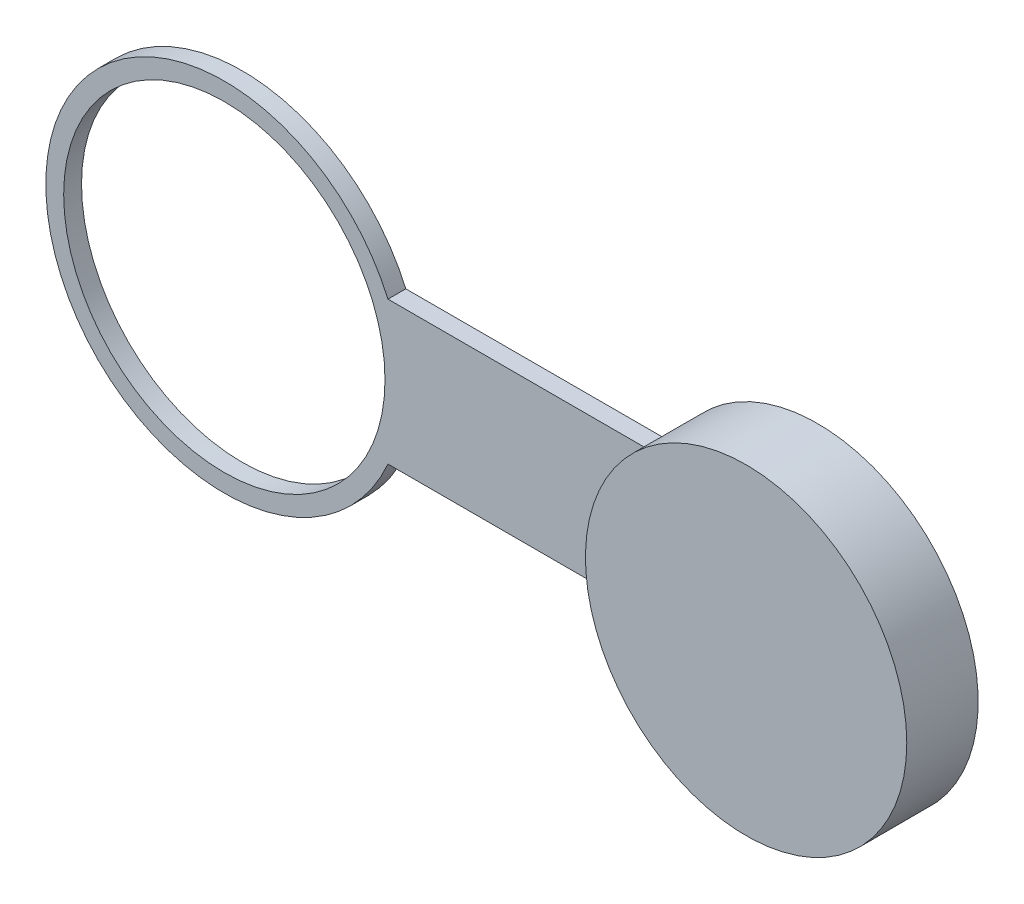
ISO-10303-21;
HEADER;
FILE_DESCRIPTION(('STEP AP214'),'2;1');
FILE_NAME('part.step','',(''),(''),'','','');
FILE_SCHEMA(('AUTOMOTIVE_DESIGN { 1 0 10303 214 1 1 1 1 }'));
ENDSEC;
DATA;
#1=APPLICATION_CONTEXT('core data for automotive mechanical design processes');
#2=APPLICATION_PROTOCOL_DEFINITION('international standard','automotive_design',2000,#1);
#3=PRODUCT_CONTEXT('',#1,'mechanical');
#4=PRODUCT('Part','Part','',(#3));
#5=PRODUCT_RELATED_PRODUCT_CATEGORY('part','',(#4));
#6=PRODUCT_DEFINITION_FORMATION('','',#4);
#7=PRODUCT_DEFINITION_CONTEXT('part definition',#1,'design');
#8=PRODUCT_DEFINITION('design','',#6,#7);
#9=PRODUCT_DEFINITION_SHAPE('','',#8);
#10=(LENGTH_UNIT() NAMED_UNIT(*) SI_UNIT(.MILLI.,.METRE.));
#11=(NAMED_UNIT(*) PLANE_ANGLE_UNIT() SI_UNIT($,.RADIAN.));
#12=(NAMED_UNIT(*) SI_UNIT($,.STERADIAN.) SOLID_ANGLE_UNIT());
#13=UNCERTAINTY_MEASURE_WITH_UNIT(LENGTH_MEASURE(1.E-05),#10,'distance_accuracy_value','');
#14=(GEOMETRIC_REPRESENTATION_CONTEXT(3) GLOBAL_UNCERTAINTY_ASSIGNED_CONTEXT((#13)) GLOBAL_UNIT_ASSIGNED_CONTEXT((#10,
#11,#12)) REPRESENTATION_CONTEXT('',''));
#15=CARTESIAN_POINT('',(0.,0.,0.));
#16=DIRECTION('',(0.,0.,1.));
#17=DIRECTION('',(1.,0.,0.));
#18=AXIS2_PLACEMENT_3D('',#15,#16,#17);
#19=CARTESIAN_POINT('',(0.,0.,20.));
#20=DIRECTION('',(0.,0.,-1.));
#21=DIRECTION('',(-1.,0.,0.));
#22=AXIS2_PLACEMENT_3D('',#19,#20,#21);
#23=CYLINDRICAL_SURFACE('',#22,45.);
#24=CARTESIAN_POINT('',(0.,0.,4.99999999999999));
#25=DIRECTION('',(0.,0.,-1.));
#26=DIRECTION('',(-1.,0.,0.));
#27=AXIS2_PLACEMENT_3D('',#24,#25,#26);
#28=CIRCLE('',#27,45.);
#29=CARTESIAN_POINT('',(-40.3112887414928,-20.,4.99999999999999));
#30=VERTEX_POINT('',#29);
#31=CARTESIAN_POINT('',(-40.3112887414928,20.,4.99999999999999));
#32=VERTEX_POINT('',#31);
#33=EDGE_CURVE('E51',#30,#32,#28,.T.);
#34=ORIENTED_EDGE('',*,*,#33,.F.);
#35=DIRECTION('',(0.,0.,-1.));
#36=VECTOR('',#35,1.);
#37=CARTESIAN_POINT('',(-40.3112887414928,-20.,4.99999999999999));
#38=LINE('',#37,#36);
#39=CARTESIAN_POINT('',(-40.3112887414928,-20.,0.));
#40=VERTEX_POINT('',#39);
#41=EDGE_CURVE('E95',#30,#40,#38,.T.);
#42=ORIENTED_EDGE('',*,*,#41,.T.);
#43=CARTESIAN_POINT('',(0.,0.,0.));
#44=DIRECTION('',(0.,0.,1.));
#45=DIRECTION('',(1.,0.,0.));
#46=AXIS2_PLACEMENT_3D('',#43,#44,#45);
#47=CIRCLE('',#46,45.);
#48=CARTESIAN_POINT('',(-40.3112887414928,20.,0.));
#49=VERTEX_POINT('',#48);
#50=EDGE_CURVE('E36',#40,#49,#47,.T.);
#51=ORIENTED_EDGE('',*,*,#50,.T.);
#52=DIRECTION('',(0.,0.,-1.));
#53=VECTOR('',#52,1.);
#54=CARTESIAN_POINT('',(-40.3112887414928,20.,4.99999999999999));
#55=LINE('',#54,#53);
#56=EDGE_CURVE('E47',#32,#49,#55,.T.);
#57=ORIENTED_EDGE('',*,*,#56,.F.);
#58=EDGE_LOOP('',(#34,#42,#51,#57));
#59=FACE_BOUND('',#58,.T.);
#60=CARTESIAN_POINT('',(0.,0.,20.));
#61=DIRECTION('',(0.,0.,1.));
#62=DIRECTION('',(1.,0.,0.));
#63=AXIS2_PLACEMENT_3D('',#60,#61,#62);
#64=CIRCLE('',#63,45.);
#65=CARTESIAN_POINT('',(45.,0.,20.));
#66=VERTEX_POINT('',#65);
#67=EDGE_CURVE('E11',#66,#66,#64,.T.);
#68=ORIENTED_EDGE('',*,*,#67,.F.);
#69=EDGE_LOOP('',(#68));
#70=FACE_BOUND('',#69,.T.);
#71=ADVANCED_FACE('F33',(#59,#70),#23,.T.);
#72=CARTESIAN_POINT('',(0.,0.,20.));
#73=DIRECTION('',(0.,0.,1.));
#74=DIRECTION('',(1.,0.,0.));
#75=AXIS2_PLACEMENT_3D('',#72,#73,#74);
#76=PLANE('',#75);
#77=ORIENTED_EDGE('',*,*,#67,.T.);
#78=EDGE_LOOP('',(#77));
#79=FACE_BOUND('',#78,.T.);
#80=ADVANCED_FACE('F121',(#79),#76,.T.);
#81=CARTESIAN_POINT('',(0.,0.,0.));
#82=DIRECTION('',(0.,0.,1.));
#83=DIRECTION('',(1.,0.,0.));
#84=AXIS2_PLACEMENT_3D('',#81,#82,#83);
#85=PLANE('',#84);
#86=ORIENTED_EDGE('',*,*,#50,.F.);
#87=DIRECTION('',(-1.,0.,0.));
#88=VECTOR('',#87,1.);
#89=CARTESIAN_POINT('',(0.,-20.,0.));
#90=LINE('',#89,#88);
#91=CARTESIAN_POINT('',(-115.311288741493,-20.,0.));
#92=VERTEX_POINT('',#91);
#93=EDGE_CURVE('E106',#40,#92,#90,.T.);
#94=ORIENTED_EDGE('',*,*,#93,.T.);
#95=CARTESIAN_POINT('',(-161.137045691051,0.,0.));
#96=DIRECTION('',(0.,0.,-1.));
#97=DIRECTION('',(-1.,0.,0.));
#98=AXIS2_PLACEMENT_3D('',#95,#96,#97);
#99=CIRCLE('',#98,50.);
#100=CARTESIAN_POINT('',(-115.311288741493,20.,0.));
#101=VERTEX_POINT('',#100);
#102=EDGE_CURVE('E77',#92,#101,#99,.T.);
#103=ORIENTED_EDGE('',*,*,#102,.T.);
#104=DIRECTION('',(-1.,0.,0.));
#105=VECTOR('',#104,1.);
#106=CARTESIAN_POINT('',(0.,20.,0.));
#107=LINE('',#106,#105);
#108=EDGE_CURVE('E99',#49,#101,#107,.T.);
#109=ORIENTED_EDGE('',*,*,#108,.F.);
#110=EDGE_LOOP('',(#86,#94,#103,#109));
#111=FACE_BOUND('',#110,.T.);
#112=CARTESIAN_POINT('',(-161.137045691051,0.,0.));
#113=DIRECTION('',(0.,0.,-1.));
#114=DIRECTION('',(-1.,0.,0.));
#115=AXIS2_PLACEMENT_3D('',#112,#113,#114);
#116=CIRCLE('',#115,45.);
#117=CARTESIAN_POINT('',(-206.137045691051,0.,0.));
#118=VERTEX_POINT('',#117);
#119=EDGE_CURVE('E96',#118,#118,#116,.T.);
#120=ORIENTED_EDGE('',*,*,#119,.F.);
#121=EDGE_LOOP('',(#120));
#122=FACE_BOUND('',#121,.T.);
#123=ADVANCED_FACE('F117',(#111,#122),#85,.F.);
#124=CARTESIAN_POINT('',(0.,-20.,4.99999999999999));
#125=DIRECTION('',(0.,-1.,0.));
#126=DIRECTION('',(0.,0.,-1.));
#127=AXIS2_PLACEMENT_3D('',#124,#125,#126);
#128=PLANE('',#127);
#129=ORIENTED_EDGE('',*,*,#93,.F.);
#130=ORIENTED_EDGE('',*,*,#41,.F.);
#131=DIRECTION('',(-1.,0.,0.));
#132=VECTOR('',#131,1.);
#133=CARTESIAN_POINT('',(0.,-20.,4.99999999999999));
#134=LINE('',#133,#132);
#135=CARTESIAN_POINT('',(-115.311288741493,-20.,4.99999999999999));
#136=VERTEX_POINT('',#135);
#137=EDGE_CURVE('E89',#30,#136,#134,.T.);
#138=ORIENTED_EDGE('',*,*,#137,.T.);
#139=DIRECTION('',(0.,0.,-1.));
#140=VECTOR('',#139,1.);
#141=CARTESIAN_POINT('',(-115.311288741493,-20.,4.99999999999999));
#142=LINE('',#141,#140);
#143=EDGE_CURVE('E72',#136,#92,#142,.T.);
#144=ORIENTED_EDGE('',*,*,#143,.T.);
#145=EDGE_LOOP('',(#129,#130,#138,#144));
#146=FACE_BOUND('',#145,.T.);
#147=ADVANCED_FACE('F94',(#146),#128,.T.);
#148=CARTESIAN_POINT('',(0.,20.,4.99999999999999));
#149=DIRECTION('',(0.,-1.,0.));
#150=DIRECTION('',(0.,0.,-1.));
#151=AXIS2_PLACEMENT_3D('',#148,#149,#150);
#152=PLANE('',#151);
#153=ORIENTED_EDGE('',*,*,#108,.T.);
#154=DIRECTION('',(0.,0.,-1.));
#155=VECTOR('',#154,1.);
#156=CARTESIAN_POINT('',(-115.311288741493,20.,4.99999999999999));
#157=LINE('',#156,#155);
#158=CARTESIAN_POINT('',(-115.311288741493,20.,4.99999999999999));
#159=VERTEX_POINT('',#158);
#160=EDGE_CURVE('E82',#159,#101,#157,.T.);
#161=ORIENTED_EDGE('',*,*,#160,.F.);
#162=DIRECTION('',(-1.,0.,0.));
#163=VECTOR('',#162,1.);
#164=CARTESIAN_POINT('',(0.,20.,4.99999999999999));
#165=LINE('',#164,#163);
#166=EDGE_CURVE('E91',#32,#159,#165,.T.);
#167=ORIENTED_EDGE('',*,*,#166,.F.);
#168=ORIENTED_EDGE('',*,*,#56,.T.);
#169=EDGE_LOOP('',(#153,#161,#167,#168));
#170=FACE_BOUND('',#169,.T.);
#171=ADVANCED_FACE('F115',(#170),#152,.F.);
#172=CARTESIAN_POINT('',(-161.137045691051,0.,4.99999999999999));
#173=DIRECTION('',(0.,0.,-1.));
#174=DIRECTION('',(-1.,0.,0.));
#175=AXIS2_PLACEMENT_3D('',#172,#173,#174);
#176=CYLINDRICAL_SURFACE('',#175,50.);
#177=ORIENTED_EDGE('',*,*,#102,.F.);
#178=ORIENTED_EDGE('',*,*,#143,.F.);
#179=CARTESIAN_POINT('',(-161.137045691051,0.,4.99999999999999));
#180=DIRECTION('',(0.,0.,-1.));
#181=DIRECTION('',(-1.,0.,0.));
#182=AXIS2_PLACEMENT_3D('',#179,#180,#181);
#183=CIRCLE('',#182,50.);
#184=EDGE_CURVE('E75',#136,#159,#183,.T.);
#185=ORIENTED_EDGE('',*,*,#184,.T.);
#186=ORIENTED_EDGE('',*,*,#160,.T.);
#187=EDGE_LOOP('',(#177,#178,#185,#186));
#188=FACE_BOUND('',#187,.T.);
#189=ADVANCED_FACE('F74',(#188),#176,.T.);
#190=CARTESIAN_POINT('',(-161.137045691051,0.,4.99999999999999));
#191=DIRECTION('',(0.,0.,-1.));
#192=DIRECTION('',(-1.,0.,0.));
#193=AXIS2_PLACEMENT_3D('',#190,#191,#192);
#194=CYLINDRICAL_SURFACE('',#193,45.);
#195=CARTESIAN_POINT('',(-161.137045691051,0.,4.99999999999999));
#196=DIRECTION('',(0.,0.,-1.));
#197=DIRECTION('',(-1.,0.,0.));
#198=AXIS2_PLACEMENT_3D('',#195,#196,#197);
#199=CIRCLE('',#198,45.);
#200=CARTESIAN_POINT('',(-206.137045691051,0.,4.99999999999999));
#201=VERTEX_POINT('',#200);
#202=EDGE_CURVE('E83',#201,#201,#199,.T.);
#203=ORIENTED_EDGE('',*,*,#202,.F.);
#204=EDGE_LOOP('',(#203));
#205=FACE_BOUND('',#204,.T.);
#206=ORIENTED_EDGE('',*,*,#119,.T.);
#207=EDGE_LOOP('',(#206));
#208=FACE_BOUND('',#207,.T.);
#209=ADVANCED_FACE('F134',(#205,#208),#194,.F.);
#210=CARTESIAN_POINT('',(0.,0.,4.99999999999999));
#211=DIRECTION('',(0.,0.,-1.));
#212=DIRECTION('',(-1.,0.,0.));
#213=AXIS2_PLACEMENT_3D('',#210,#211,#212);
#214=PLANE('',#213);
#215=ORIENTED_EDGE('',*,*,#137,.F.);
#216=ORIENTED_EDGE('',*,*,#33,.T.);
#217=ORIENTED_EDGE('',*,*,#166,.T.);
#218=ORIENTED_EDGE('',*,*,#184,.F.);
#219=EDGE_LOOP('',(#215,#216,#217,#218));
#220=FACE_BOUND('',#219,.T.);
#221=ORIENTED_EDGE('',*,*,#202,.T.);
#222=EDGE_LOOP('',(#221));
#223=FACE_BOUND('',#222,.T.);
#224=ADVANCED_FACE('F87',(#220,#223),#214,.F.);
#225=CLOSED_SHELL('',(#71,#80,#123,#147,#171,#189,#209,#224));
#226=MANIFOLD_SOLID_BREP('B2',#225);
#227=ADVANCED_BREP_SHAPE_REPRESENTATION('',(#18,#226),#14);
#228=SHAPE_DEFINITION_REPRESENTATION(#9,#227);
ENDSEC;
END-ISO-10303-21;
